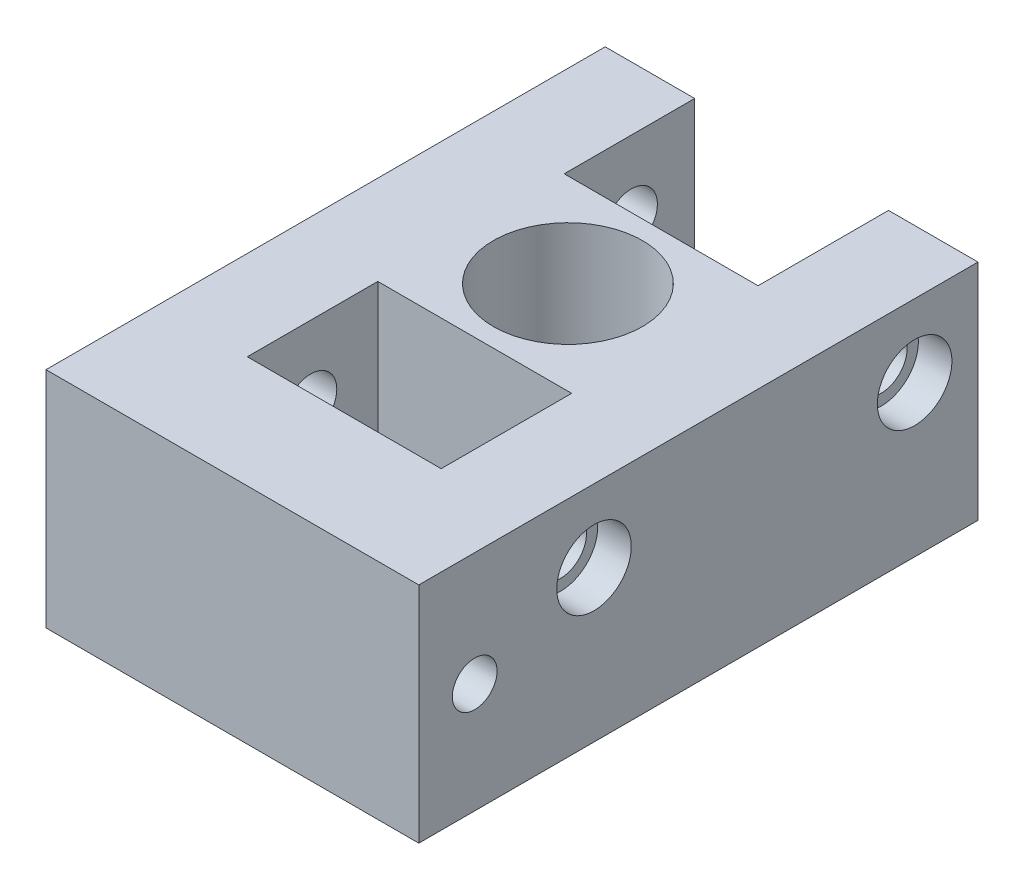
ISO-10303-21;
HEADER;
FILE_DESCRIPTION(('STEP AP214'),'2;1');
FILE_NAME('part.step','',(''),(''),'','','');
FILE_SCHEMA(('AUTOMOTIVE_DESIGN { 1 0 10303 214 1 1 1 1 }'));
ENDSEC;
DATA;
#1=APPLICATION_CONTEXT('core data for automotive mechanical design processes');
#2=APPLICATION_PROTOCOL_DEFINITION('international standard','automotive_design',2000,#1);
#3=PRODUCT_CONTEXT('',#1,'mechanical');
#4=PRODUCT('Part','Part','',(#3));
#5=PRODUCT_RELATED_PRODUCT_CATEGORY('part','',(#4));
#6=PRODUCT_DEFINITION_FORMATION('','',#4);
#7=PRODUCT_DEFINITION_CONTEXT('part definition',#1,'design');
#8=PRODUCT_DEFINITION('design','',#6,#7);
#9=PRODUCT_DEFINITION_SHAPE('','',#8);
#10=(LENGTH_UNIT() NAMED_UNIT(*) SI_UNIT(.MILLI.,.METRE.));
#11=(NAMED_UNIT(*) PLANE_ANGLE_UNIT() SI_UNIT($,.RADIAN.));
#12=(NAMED_UNIT(*) SI_UNIT($,.STERADIAN.) SOLID_ANGLE_UNIT());
#13=UNCERTAINTY_MEASURE_WITH_UNIT(LENGTH_MEASURE(1.E-05),#10,'distance_accuracy_value','');
#14=(GEOMETRIC_REPRESENTATION_CONTEXT(3) GLOBAL_UNCERTAINTY_ASSIGNED_CONTEXT((#13)) GLOBAL_UNIT_ASSIGNED_CONTEXT((#10,
#11,#12)) REPRESENTATION_CONTEXT('',''));
#15=CARTESIAN_POINT('',(0.,0.,0.));
#16=DIRECTION('',(0.,0.,1.));
#17=DIRECTION('',(1.,0.,0.));
#18=AXIS2_PLACEMENT_3D('',#15,#16,#17);
#19=CARTESIAN_POINT('',(10.,4.05,1.7));
#20=DIRECTION('',(-1.,0.,0.));
#21=DIRECTION('',(0.,0.,1.));
#22=AXIS2_PLACEMENT_3D('',#19,#20,#21);
#23=CYLINDRICAL_SURFACE('',#22,0.700000000000001);
#24=CARTESIAN_POINT('',(2.4,4.05,1.7));
#25=DIRECTION('',(-1.,0.,0.));
#26=DIRECTION('',(0.,0.,1.));
#27=AXIS2_PLACEMENT_3D('',#24,#25,#26);
#28=CIRCLE('',#27,0.700000000000001);
#29=CARTESIAN_POINT('',(2.4,4.05,2.4));
#30=VERTEX_POINT('',#29);
#31=EDGE_CURVE('E212',#30,#30,#28,.T.);
#32=ORIENTED_EDGE('',*,*,#31,.F.);
#33=EDGE_LOOP('',(#32));
#34=FACE_BOUND('',#33,.T.);
#35=CARTESIAN_POINT('',(0.9,4.05,1.7));
#36=DIRECTION('',(-1.,0.,0.));
#37=DIRECTION('',(0.,0.,1.));
#38=AXIS2_PLACEMENT_3D('',#35,#36,#37);
#39=CIRCLE('',#38,0.700000000000001);
#40=CARTESIAN_POINT('',(0.9,4.05,2.4));
#41=VERTEX_POINT('',#40);
#42=EDGE_CURVE('E216',#41,#41,#39,.F.);
#43=ORIENTED_EDGE('',*,*,#42,.F.);
#44=EDGE_LOOP('',(#43));
#45=FACE_BOUND('',#44,.T.);
#46=ADVANCED_FACE('F39',(#34,#45),#23,.F.);
#47=CARTESIAN_POINT('',(10.,4.05,10.3));
#48=DIRECTION('',(-1.,0.,0.));
#49=DIRECTION('',(0.,0.,1.));
#50=AXIS2_PLACEMENT_3D('',#47,#48,#49);
#51=CYLINDRICAL_SURFACE('',#50,0.7);
#52=CARTESIAN_POINT('',(2.4,4.05,10.3));
#53=DIRECTION('',(1.,0.,0.));
#54=DIRECTION('',(0.,0.,-1.));
#55=AXIS2_PLACEMENT_3D('',#52,#53,#54);
#56=CIRCLE('',#55,0.7);
#57=CARTESIAN_POINT('',(2.4,4.05,9.60000000000001));
#58=VERTEX_POINT('',#57);
#59=EDGE_CURVE('E156',#58,#58,#56,.T.);
#60=ORIENTED_EDGE('',*,*,#59,.T.);
#61=EDGE_LOOP('',(#60));
#62=FACE_BOUND('',#61,.T.);
#63=CARTESIAN_POINT('',(0.9,4.05,10.3));
#64=DIRECTION('',(-1.,0.,0.));
#65=DIRECTION('',(0.,0.,1.));
#66=AXIS2_PLACEMENT_3D('',#63,#64,#65);
#67=CIRCLE('',#66,0.7);
#68=CARTESIAN_POINT('',(0.9,4.05,11.));
#69=VERTEX_POINT('',#68);
#70=EDGE_CURVE('E220',#69,#69,#67,.F.);
#71=ORIENTED_EDGE('',*,*,#70,.F.);
#72=EDGE_LOOP('',(#71));
#73=FACE_BOUND('',#72,.T.);
#74=ADVANCED_FACE('F359',(#62,#73),#51,.F.);
#75=CARTESIAN_POINT('',(0.,6.,0.));
#76=DIRECTION('',(0.,0.,1.));
#77=DIRECTION('',(1.,0.,0.));
#78=AXIS2_PLACEMENT_3D('',#75,#76,#77);
#79=PLANE('',#78);
#80=DIRECTION('',(0.,1.,0.));
#81=VECTOR('',#80,1.);
#82=CARTESIAN_POINT('',(7.6,-4.26817357768593,0.));
#83=LINE('',#82,#81);
#84=CARTESIAN_POINT('',(7.6,2.,0.));
#85=VERTEX_POINT('',#84);
#86=CARTESIAN_POINT('',(7.6,6.,0.));
#87=VERTEX_POINT('',#86);
#88=EDGE_CURVE('E263',#85,#87,#83,.T.);
#89=ORIENTED_EDGE('',*,*,#88,.T.);
#90=DIRECTION('',(-1.,0.,0.));
#91=VECTOR('',#90,1.);
#92=CARTESIAN_POINT('',(0.,6.,0.));
#93=LINE('',#92,#91);
#94=CARTESIAN_POINT('',(10.,6.,0.));
#95=VERTEX_POINT('',#94);
#96=EDGE_CURVE('E199',#95,#87,#93,.T.);
#97=ORIENTED_EDGE('',*,*,#96,.F.);
#98=DIRECTION('',(0.,-1.,0.));
#99=VECTOR('',#98,1.);
#100=CARTESIAN_POINT('',(10.,6.,0.));
#101=LINE('',#100,#99);
#102=CARTESIAN_POINT('',(10.,0.,0.));
#103=VERTEX_POINT('',#102);
#104=EDGE_CURVE('E12',#95,#103,#101,.T.);
#105=ORIENTED_EDGE('',*,*,#104,.T.);
#106=DIRECTION('',(-1.,0.,0.));
#107=VECTOR('',#106,1.);
#108=CARTESIAN_POINT('',(0.,0.,0.));
#109=LINE('',#108,#107);
#110=CARTESIAN_POINT('',(0.,0.,0.));
#111=VERTEX_POINT('',#110);
#112=EDGE_CURVE('E197',#103,#111,#109,.T.);
#113=ORIENTED_EDGE('',*,*,#112,.T.);
#114=DIRECTION('',(0.,-1.,0.));
#115=VECTOR('',#114,1.);
#116=CARTESIAN_POINT('',(0.,6.,0.));
#117=LINE('',#116,#115);
#118=CARTESIAN_POINT('',(0.,6.,0.));
#119=VERTEX_POINT('',#118);
#120=EDGE_CURVE('E49',#119,#111,#117,.T.);
#121=ORIENTED_EDGE('',*,*,#120,.F.);
#122=CARTESIAN_POINT('',(2.4,6.,0.));
#123=VERTEX_POINT('',#122);
#124=EDGE_CURVE('E58',#123,#119,#93,.T.);
#125=ORIENTED_EDGE('',*,*,#124,.F.);
#126=DIRECTION('',(0.,1.,0.));
#127=VECTOR('',#126,1.);
#128=CARTESIAN_POINT('',(2.4,-4.26817357768593,0.));
#129=LINE('',#128,#127);
#130=CARTESIAN_POINT('',(2.4,2.,0.));
#131=VERTEX_POINT('',#130);
#132=EDGE_CURVE('E113',#131,#123,#129,.T.);
#133=ORIENTED_EDGE('',*,*,#132,.F.);
#134=DIRECTION('',(-1.,0.,0.));
#135=VECTOR('',#134,1.);
#136=CARTESIAN_POINT('',(0.,2.,0.));
#137=LINE('',#136,#135);
#138=EDGE_CURVE('E127',#85,#131,#137,.T.);
#139=ORIENTED_EDGE('',*,*,#138,.F.);
#140=EDGE_LOOP('',(#89,#97,#105,#113,#121,#125,#133,#139));
#141=FACE_BOUND('',#140,.T.);
#142=ADVANCED_FACE('F142',(#141),#79,.F.);
#143=CARTESIAN_POINT('',(0.,6.,0.));
#144=DIRECTION('',(0.,1.,0.));
#145=DIRECTION('',(0.,0.,1.));
#146=AXIS2_PLACEMENT_3D('',#143,#144,#145);
#147=PLANE('',#146);
#148=DIRECTION('',(1.,0.,0.));
#149=VECTOR('',#148,1.);
#150=CARTESIAN_POINT('',(0.,6.,12.));
#151=LINE('',#150,#149);
#152=CARTESIAN_POINT('',(2.4,6.,12.));
#153=VERTEX_POINT('',#152);
#154=CARTESIAN_POINT('',(7.6,6.,12.));
#155=VERTEX_POINT('',#154);
#156=EDGE_CURVE('E301',#153,#155,#151,.T.);
#157=ORIENTED_EDGE('',*,*,#156,.F.);
#158=DIRECTION('',(0.,0.,-1.));
#159=VECTOR('',#158,1.);
#160=CARTESIAN_POINT('',(2.4,6.,12.));
#161=LINE('',#160,#159);
#162=CARTESIAN_POINT('',(2.4,6.,8.5));
#163=VERTEX_POINT('',#162);
#164=EDGE_CURVE('E172',#153,#163,#161,.T.);
#165=ORIENTED_EDGE('',*,*,#164,.T.);
#166=DIRECTION('',(-1.,0.,0.));
#167=VECTOR('',#166,1.);
#168=CARTESIAN_POINT('',(7.6,6.,8.5));
#169=LINE('',#168,#167);
#170=CARTESIAN_POINT('',(7.6,6.,8.5));
#171=VERTEX_POINT('',#170);
#172=EDGE_CURVE('E104',#171,#163,#169,.T.);
#173=ORIENTED_EDGE('',*,*,#172,.F.);
#174=DIRECTION('',(0.,0.,-1.));
#175=VECTOR('',#174,1.);
#176=CARTESIAN_POINT('',(7.6,6.,12.));
#177=LINE('',#176,#175);
#178=EDGE_CURVE('E168',#155,#171,#177,.T.);
#179=ORIENTED_EDGE('',*,*,#178,.F.);
#180=EDGE_LOOP('',(#157,#165,#173,#179));
#181=FACE_BOUND('',#180,.T.);
#182=CARTESIAN_POINT('',(5.,6.,6.));
#183=DIRECTION('',(0.,1.,0.));
#184=DIRECTION('',(0.,0.,1.));
#185=AXIS2_PLACEMENT_3D('',#182,#183,#184);
#186=CIRCLE('',#185,2.);
#187=CARTESIAN_POINT('',(5.,6.,8.));
#188=VERTEX_POINT('',#187);
#189=EDGE_CURVE('E140',#188,#188,#186,.T.);
#190=ORIENTED_EDGE('',*,*,#189,.F.);
#191=EDGE_LOOP('',(#190));
#192=FACE_BOUND('',#191,.T.);
#193=ORIENTED_EDGE('',*,*,#96,.T.);
#194=DIRECTION('',(0.,0.,1.));
#195=VECTOR('',#194,1.);
#196=CARTESIAN_POINT('',(7.6,6.,0.));
#197=LINE('',#196,#195);
#198=CARTESIAN_POINT('',(7.6,6.,3.5));
#199=VERTEX_POINT('',#198);
#200=EDGE_CURVE('E143',#87,#199,#197,.T.);
#201=ORIENTED_EDGE('',*,*,#200,.T.);
#202=DIRECTION('',(-1.,0.,0.));
#203=VECTOR('',#202,1.);
#204=CARTESIAN_POINT('',(7.6,6.,3.5));
#205=LINE('',#204,#203);
#206=CARTESIAN_POINT('',(2.4,6.,3.5));
#207=VERTEX_POINT('',#206);
#208=EDGE_CURVE('E148',#199,#207,#205,.T.);
#209=ORIENTED_EDGE('',*,*,#208,.T.);
#210=DIRECTION('',(0.,0.,1.));
#211=VECTOR('',#210,1.);
#212=CARTESIAN_POINT('',(2.4,6.,0.));
#213=LINE('',#212,#211);
#214=EDGE_CURVE('E175',#123,#207,#213,.T.);
#215=ORIENTED_EDGE('',*,*,#214,.F.);
#216=ORIENTED_EDGE('',*,*,#124,.T.);
#217=DIRECTION('',(0.,0.,1.));
#218=VECTOR('',#217,1.);
#219=CARTESIAN_POINT('',(0.,6.,0.));
#220=LINE('',#219,#218);
#221=CARTESIAN_POINT('',(0.,6.,15.));
#222=VERTEX_POINT('',#221);
#223=EDGE_CURVE('E194',#119,#222,#220,.T.);
#224=ORIENTED_EDGE('',*,*,#223,.T.);
#225=DIRECTION('',(1.,0.,0.));
#226=VECTOR('',#225,1.);
#227=CARTESIAN_POINT('',(0.,6.,15.));
#228=LINE('',#227,#226);
#229=CARTESIAN_POINT('',(10.,6.,15.));
#230=VERTEX_POINT('',#229);
#231=EDGE_CURVE('E316',#222,#230,#228,.T.);
#232=ORIENTED_EDGE('',*,*,#231,.T.);
#233=DIRECTION('',(0.,0.,-1.));
#234=VECTOR('',#233,1.);
#235=CARTESIAN_POINT('',(10.,6.,0.));
#236=LINE('',#235,#234);
#237=EDGE_CURVE('E196',#230,#95,#236,.T.);
#238=ORIENTED_EDGE('',*,*,#237,.T.);
#239=EDGE_LOOP('',(#193,#201,#209,#215,#216,#224,#232,#238));
#240=FACE_BOUND('',#239,.T.);
#241=ADVANCED_FACE('F273',(#181,#192,#240),#147,.T.);
#242=CARTESIAN_POINT('',(5.,0.,10.5));
#243=DIRECTION('',(0.,1.,0.));
#244=DIRECTION('',(0.,0.,1.));
#245=AXIS2_PLACEMENT_3D('',#242,#243,#244);
#246=CYLINDRICAL_SURFACE('',#245,1.);
#247=CARTESIAN_POINT('',(5.,0.,10.5));
#248=DIRECTION('',(0.,1.,0.));
#249=DIRECTION('',(0.,0.,1.));
#250=AXIS2_PLACEMENT_3D('',#247,#248,#249);
#251=CIRCLE('',#250,1.);
#252=CARTESIAN_POINT('',(5.,0.,11.5));
#253=VERTEX_POINT('',#252);
#254=EDGE_CURVE('E187',#253,#253,#251,.T.);
#255=ORIENTED_EDGE('',*,*,#254,.F.);
#256=EDGE_LOOP('',(#255));
#257=FACE_BOUND('',#256,.T.);
#258=CARTESIAN_POINT('',(5.,2.,10.5));
#259=DIRECTION('',(0.,1.,0.));
#260=DIRECTION('',(0.,0.,1.));
#261=AXIS2_PLACEMENT_3D('',#258,#259,#260);
#262=CIRCLE('',#261,1.);
#263=CARTESIAN_POINT('',(5.,2.,11.5));
#264=VERTEX_POINT('',#263);
#265=EDGE_CURVE('E134',#264,#264,#262,.F.);
#266=ORIENTED_EDGE('',*,*,#265,.F.);
#267=EDGE_LOOP('',(#266));
#268=FACE_BOUND('',#267,.T.);
#269=ADVANCED_FACE('F417',(#257,#268),#246,.F.);
#270=CARTESIAN_POINT('',(5.,0.,1.5));
#271=DIRECTION('',(0.,1.,0.));
#272=DIRECTION('',(0.,0.,1.));
#273=AXIS2_PLACEMENT_3D('',#270,#271,#272);
#274=CYLINDRICAL_SURFACE('',#273,1.);
#275=CARTESIAN_POINT('',(5.,0.,1.5));
#276=DIRECTION('',(0.,1.,0.));
#277=DIRECTION('',(0.,0.,1.));
#278=AXIS2_PLACEMENT_3D('',#275,#276,#277);
#279=CIRCLE('',#278,1.);
#280=CARTESIAN_POINT('',(5.,0.,2.5));
#281=VERTEX_POINT('',#280);
#282=EDGE_CURVE('E188',#281,#281,#279,.T.);
#283=ORIENTED_EDGE('',*,*,#282,.F.);
#284=EDGE_LOOP('',(#283));
#285=FACE_BOUND('',#284,.T.);
#286=CARTESIAN_POINT('',(5.,2.,1.5));
#287=DIRECTION('',(0.,1.,0.));
#288=DIRECTION('',(0.,0.,1.));
#289=AXIS2_PLACEMENT_3D('',#286,#287,#288);
#290=CIRCLE('',#289,1.);
#291=CARTESIAN_POINT('',(5.,2.,2.5));
#292=VERTEX_POINT('',#291);
#293=EDGE_CURVE('E135',#292,#292,#290,.F.);
#294=ORIENTED_EDGE('',*,*,#293,.F.);
#295=EDGE_LOOP('',(#294));
#296=FACE_BOUND('',#295,.T.);
#297=ADVANCED_FACE('F414',(#285,#296),#274,.F.);
#298=CARTESIAN_POINT('',(0.,6.,0.));
#299=DIRECTION('',(1.,0.,0.));
#300=DIRECTION('',(0.,0.,-1.));
#301=AXIS2_PLACEMENT_3D('',#298,#299,#300);
#302=PLANE('',#301);
#303=CARTESIAN_POINT('',(0.,2.95143832321382,13.5));
#304=DIRECTION('',(1.,0.,0.));
#305=DIRECTION('',(0.,0.,-1.));
#306=AXIS2_PLACEMENT_3D('',#303,#304,#305);
#307=CIRCLE('',#306,0.6);
#308=CARTESIAN_POINT('',(0.,2.95143832321382,12.9));
#309=VERTEX_POINT('',#308);
#310=EDGE_CURVE('E315',#309,#309,#307,.T.);
#311=ORIENTED_EDGE('',*,*,#310,.T.);
#312=EDGE_LOOP('',(#311));
#313=FACE_BOUND('',#312,.T.);
#314=CARTESIAN_POINT('',(0.,4.05,1.7));
#315=DIRECTION('',(-1.,0.,0.));
#316=DIRECTION('',(0.,0.,1.));
#317=AXIS2_PLACEMENT_3D('',#314,#315,#316);
#318=CIRCLE('',#317,1.);
#319=CARTESIAN_POINT('',(0.,4.05,2.7));
#320=VERTEX_POINT('',#319);
#321=EDGE_CURVE('E248',#320,#320,#318,.T.);
#322=ORIENTED_EDGE('',*,*,#321,.F.);
#323=EDGE_LOOP('',(#322));
#324=FACE_BOUND('',#323,.T.);
#325=CARTESIAN_POINT('',(0.,4.05,10.3));
#326=DIRECTION('',(-1.,0.,0.));
#327=DIRECTION('',(0.,0.,1.));
#328=AXIS2_PLACEMENT_3D('',#325,#326,#327);
#329=CIRCLE('',#328,1.);
#330=CARTESIAN_POINT('',(0.,4.05,11.3));
#331=VERTEX_POINT('',#330);
#332=EDGE_CURVE('E251',#331,#331,#329,.T.);
#333=ORIENTED_EDGE('',*,*,#332,.F.);
#334=EDGE_LOOP('',(#333));
#335=FACE_BOUND('',#334,.T.);
#336=DIRECTION('',(0.,0.,1.));
#337=VECTOR('',#336,1.);
#338=CARTESIAN_POINT('',(0.,0.,0.));
#339=LINE('',#338,#337);
#340=CARTESIAN_POINT('',(0.,0.,15.));
#341=VERTEX_POINT('',#340);
#342=EDGE_CURVE('E191',#111,#341,#339,.T.);
#343=ORIENTED_EDGE('',*,*,#342,.T.);
#344=DIRECTION('',(0.,1.,0.));
#345=VECTOR('',#344,1.);
#346=CARTESIAN_POINT('',(0.,0.,15.));
#347=LINE('',#346,#345);
#348=EDGE_CURVE('E290',#341,#222,#347,.T.);
#349=ORIENTED_EDGE('',*,*,#348,.T.);
#350=ORIENTED_EDGE('',*,*,#223,.F.);
#351=ORIENTED_EDGE('',*,*,#120,.T.);
#352=EDGE_LOOP('',(#343,#349,#350,#351));
#353=FACE_BOUND('',#352,.T.);
#354=ADVANCED_FACE('F41',(#313,#324,#335,#353),#302,.F.);
#355=CARTESIAN_POINT('',(10.,6.,0.));
#356=DIRECTION('',(-1.,0.,0.));
#357=DIRECTION('',(0.,0.,1.));
#358=AXIS2_PLACEMENT_3D('',#355,#356,#357);
#359=PLANE('',#358);
#360=CARTESIAN_POINT('',(10.,2.95143832321382,13.5));
#361=DIRECTION('',(1.,0.,0.));
#362=DIRECTION('',(0.,0.,-1.));
#363=AXIS2_PLACEMENT_3D('',#360,#361,#362);
#364=CIRCLE('',#363,0.6);
#365=CARTESIAN_POINT('',(10.,2.95143832321382,12.9));
#366=VERTEX_POINT('',#365);
#367=EDGE_CURVE('E319',#366,#366,#364,.T.);
#368=ORIENTED_EDGE('',*,*,#367,.F.);
#369=EDGE_LOOP('',(#368));
#370=FACE_BOUND('',#369,.T.);
#371=CARTESIAN_POINT('',(10.,4.05,1.7));
#372=DIRECTION('',(-1.,0.,0.));
#373=DIRECTION('',(0.,0.,1.));
#374=AXIS2_PLACEMENT_3D('',#371,#372,#373);
#375=CIRCLE('',#374,1.);
#376=CARTESIAN_POINT('',(10.,4.05,2.7));
#377=VERTEX_POINT('',#376);
#378=EDGE_CURVE('E233',#377,#377,#375,.T.);
#379=ORIENTED_EDGE('',*,*,#378,.T.);
#380=EDGE_LOOP('',(#379));
#381=FACE_BOUND('',#380,.T.);
#382=CARTESIAN_POINT('',(10.,4.05,10.3));
#383=DIRECTION('',(-1.,0.,0.));
#384=DIRECTION('',(0.,0.,1.));
#385=AXIS2_PLACEMENT_3D('',#382,#383,#384);
#386=CIRCLE('',#385,1.);
#387=CARTESIAN_POINT('',(10.,4.05,11.3));
#388=VERTEX_POINT('',#387);
#389=EDGE_CURVE('E238',#388,#388,#386,.T.);
#390=ORIENTED_EDGE('',*,*,#389,.T.);
#391=EDGE_LOOP('',(#390));
#392=FACE_BOUND('',#391,.T.);
#393=DIRECTION('',(0.,0.,-1.));
#394=VECTOR('',#393,1.);
#395=CARTESIAN_POINT('',(10.,0.,0.));
#396=LINE('',#395,#394);
#397=CARTESIAN_POINT('',(10.,0.,15.));
#398=VERTEX_POINT('',#397);
#399=EDGE_CURVE('E70',#398,#103,#396,.T.);
#400=ORIENTED_EDGE('',*,*,#399,.T.);
#401=ORIENTED_EDGE('',*,*,#104,.F.);
#402=ORIENTED_EDGE('',*,*,#237,.F.);
#403=DIRECTION('',(0.,1.,0.));
#404=VECTOR('',#403,1.);
#405=CARTESIAN_POINT('',(10.,0.,15.));
#406=LINE('',#405,#404);
#407=EDGE_CURVE('E323',#398,#230,#406,.T.);
#408=ORIENTED_EDGE('',*,*,#407,.F.);
#409=EDGE_LOOP('',(#400,#401,#402,#408));
#410=FACE_BOUND('',#409,.T.);
#411=ADVANCED_FACE('F332',(#370,#381,#392,#410),#359,.F.);
#412=CARTESIAN_POINT('',(0.,0.,0.));
#413=DIRECTION('',(0.,1.,0.));
#414=DIRECTION('',(0.,0.,1.));
#415=AXIS2_PLACEMENT_3D('',#412,#413,#414);
#416=PLANE('',#415);
#417=CARTESIAN_POINT('',(5.,0.,6.));
#418=DIRECTION('',(0.,1.,0.));
#419=DIRECTION('',(0.,0.,1.));
#420=AXIS2_PLACEMENT_3D('',#417,#418,#419);
#421=CIRCLE('',#420,2.);
#422=CARTESIAN_POINT('',(5.,0.,8.));
#423=VERTEX_POINT('',#422);
#424=EDGE_CURVE('E179',#423,#423,#421,.T.);
#425=ORIENTED_EDGE('',*,*,#424,.T.);
#426=EDGE_LOOP('',(#425));
#427=FACE_BOUND('',#426,.T.);
#428=ORIENTED_EDGE('',*,*,#282,.T.);
#429=EDGE_LOOP('',(#428));
#430=FACE_BOUND('',#429,.T.);
#431=ORIENTED_EDGE('',*,*,#254,.T.);
#432=EDGE_LOOP('',(#431));
#433=FACE_BOUND('',#432,.T.);
#434=ORIENTED_EDGE('',*,*,#342,.F.);
#435=ORIENTED_EDGE('',*,*,#112,.F.);
#436=ORIENTED_EDGE('',*,*,#399,.F.);
#437=DIRECTION('',(1.,0.,0.));
#438=VECTOR('',#437,1.);
#439=CARTESIAN_POINT('',(0.,0.,15.));
#440=LINE('',#439,#438);
#441=EDGE_CURVE('E245',#341,#398,#440,.T.);
#442=ORIENTED_EDGE('',*,*,#441,.F.);
#443=EDGE_LOOP('',(#434,#435,#436,#442));
#444=FACE_BOUND('',#443,.T.);
#445=ADVANCED_FACE('F280',(#427,#430,#433,#444),#416,.F.);
#446=CARTESIAN_POINT('',(0.,2.,0.));
#447=DIRECTION('',(0.,1.,0.));
#448=DIRECTION('',(0.,0.,1.));
#449=AXIS2_PLACEMENT_3D('',#446,#447,#448);
#450=PLANE('',#449);
#451=ORIENTED_EDGE('',*,*,#293,.T.);
#452=EDGE_LOOP('',(#451));
#453=FACE_BOUND('',#452,.T.);
#454=ORIENTED_EDGE('',*,*,#138,.T.);
#455=DIRECTION('',(0.,0.,-1.));
#456=VECTOR('',#455,1.);
#457=CARTESIAN_POINT('',(2.4,2.,0.));
#458=LINE('',#457,#456);
#459=CARTESIAN_POINT('',(2.4,2.,3.5));
#460=VERTEX_POINT('',#459);
#461=EDGE_CURVE('E129',#460,#131,#458,.T.);
#462=ORIENTED_EDGE('',*,*,#461,.F.);
#463=DIRECTION('',(1.,0.,0.));
#464=VECTOR('',#463,1.);
#465=CARTESIAN_POINT('',(7.6,2.,3.5));
#466=LINE('',#465,#464);
#467=CARTESIAN_POINT('',(7.6,2.,3.5));
#468=VERTEX_POINT('',#467);
#469=EDGE_CURVE('E79',#460,#468,#466,.T.);
#470=ORIENTED_EDGE('',*,*,#469,.T.);
#471=DIRECTION('',(0.,0.,-1.));
#472=VECTOR('',#471,1.);
#473=CARTESIAN_POINT('',(7.6,2.,0.));
#474=LINE('',#473,#472);
#475=EDGE_CURVE('E130',#468,#85,#474,.T.);
#476=ORIENTED_EDGE('',*,*,#475,.T.);
#477=EDGE_LOOP('',(#454,#462,#470,#476));
#478=FACE_BOUND('',#477,.T.);
#479=ADVANCED_FACE('F128',(#453,#478),#450,.T.);
#480=CARTESIAN_POINT('',(0.,2.,0.));
#481=DIRECTION('',(0.,1.,0.));
#482=DIRECTION('',(0.,0.,1.));
#483=AXIS2_PLACEMENT_3D('',#480,#481,#482);
#484=PLANE('',#483);
#485=ORIENTED_EDGE('',*,*,#265,.T.);
#486=EDGE_LOOP('',(#485));
#487=FACE_BOUND('',#486,.T.);
#488=DIRECTION('',(1.,0.,0.));
#489=VECTOR('',#488,1.);
#490=CARTESIAN_POINT('',(0.,2.,12.));
#491=LINE('',#490,#489);
#492=CARTESIAN_POINT('',(2.4,2.,12.));
#493=VERTEX_POINT('',#492);
#494=CARTESIAN_POINT('',(7.6,2.,12.));
#495=VERTEX_POINT('',#494);
#496=EDGE_CURVE('E184',#493,#495,#491,.T.);
#497=ORIENTED_EDGE('',*,*,#496,.T.);
#498=DIRECTION('',(0.,0.,1.));
#499=VECTOR('',#498,1.);
#500=CARTESIAN_POINT('',(7.6,2.,12.));
#501=LINE('',#500,#499);
#502=CARTESIAN_POINT('',(7.6,2.,8.5));
#503=VERTEX_POINT('',#502);
#504=EDGE_CURVE('E152',#503,#495,#501,.T.);
#505=ORIENTED_EDGE('',*,*,#504,.F.);
#506=DIRECTION('',(1.,0.,0.));
#507=VECTOR('',#506,1.);
#508=CARTESIAN_POINT('',(7.6,2.,8.5));
#509=LINE('',#508,#507);
#510=CARTESIAN_POINT('',(2.4,2.,8.5));
#511=VERTEX_POINT('',#510);
#512=EDGE_CURVE('E161',#511,#503,#509,.T.);
#513=ORIENTED_EDGE('',*,*,#512,.F.);
#514=DIRECTION('',(0.,0.,1.));
#515=VECTOR('',#514,1.);
#516=CARTESIAN_POINT('',(2.4,2.,12.));
#517=LINE('',#516,#515);
#518=EDGE_CURVE('E155',#511,#493,#517,.T.);
#519=ORIENTED_EDGE('',*,*,#518,.T.);
#520=EDGE_LOOP('',(#497,#505,#513,#519));
#521=FACE_BOUND('',#520,.T.);
#522=ADVANCED_FACE('F308',(#487,#521),#484,.T.);
#523=CARTESIAN_POINT('',(5.,0.,6.));
#524=DIRECTION('',(0.,1.,0.));
#525=DIRECTION('',(0.,0.,1.));
#526=AXIS2_PLACEMENT_3D('',#523,#524,#525);
#527=CYLINDRICAL_SURFACE('',#526,2.);
#528=ORIENTED_EDGE('',*,*,#424,.F.);
#529=EDGE_LOOP('',(#528));
#530=FACE_BOUND('',#529,.T.);
#531=ORIENTED_EDGE('',*,*,#189,.T.);
#532=EDGE_LOOP('',(#531));
#533=FACE_BOUND('',#532,.T.);
#534=ADVANCED_FACE('F401',(#530,#533),#527,.F.);
#535=CARTESIAN_POINT('',(7.6,-4.26817357768593,8.5));
#536=DIRECTION('',(0.,0.,-1.));
#537=DIRECTION('',(-1.,0.,0.));
#538=AXIS2_PLACEMENT_3D('',#535,#536,#537);
#539=PLANE('',#538);
#540=ORIENTED_EDGE('',*,*,#172,.T.);
#541=DIRECTION('',(0.,1.,0.));
#542=VECTOR('',#541,1.);
#543=CARTESIAN_POINT('',(2.4,-4.26817357768593,8.5));
#544=LINE('',#543,#542);
#545=EDGE_CURVE('E160',#511,#163,#544,.T.);
#546=ORIENTED_EDGE('',*,*,#545,.F.);
#547=ORIENTED_EDGE('',*,*,#512,.T.);
#548=DIRECTION('',(0.,1.,0.));
#549=VECTOR('',#548,1.);
#550=CARTESIAN_POINT('',(7.6,-4.26817357768593,8.5));
#551=LINE('',#550,#549);
#552=EDGE_CURVE('E163',#503,#171,#551,.T.);
#553=ORIENTED_EDGE('',*,*,#552,.T.);
#554=EDGE_LOOP('',(#540,#546,#547,#553));
#555=FACE_BOUND('',#554,.T.);
#556=ADVANCED_FACE('F397',(#555),#539,.F.);
#557=CARTESIAN_POINT('',(2.4,-4.26817357768593,12.));
#558=DIRECTION('',(1.,0.,0.));
#559=DIRECTION('',(0.,0.,-1.));
#560=AXIS2_PLACEMENT_3D('',#557,#558,#559);
#561=PLANE('',#560);
#562=ORIENTED_EDGE('',*,*,#59,.F.);
#563=EDGE_LOOP('',(#562));
#564=FACE_BOUND('',#563,.T.);
#565=ORIENTED_EDGE('',*,*,#545,.T.);
#566=ORIENTED_EDGE('',*,*,#164,.F.);
#567=DIRECTION('',(0.,1.,0.));
#568=VECTOR('',#567,1.);
#569=CARTESIAN_POINT('',(2.4,-4.26817357768593,12.));
#570=LINE('',#569,#568);
#571=EDGE_CURVE('E157',#493,#153,#570,.T.);
#572=ORIENTED_EDGE('',*,*,#571,.F.);
#573=ORIENTED_EDGE('',*,*,#518,.F.);
#574=EDGE_LOOP('',(#565,#566,#572,#573));
#575=FACE_BOUND('',#574,.T.);
#576=ADVANCED_FACE('F311',(#564,#575),#561,.T.);
#577=CARTESIAN_POINT('',(7.6,-4.26817357768593,12.));
#578=DIRECTION('',(1.,0.,0.));
#579=DIRECTION('',(0.,0.,-1.));
#580=AXIS2_PLACEMENT_3D('',#577,#578,#579);
#581=PLANE('',#580);
#582=CARTESIAN_POINT('',(7.6,4.05,10.3));
#583=DIRECTION('',(1.,0.,0.));
#584=DIRECTION('',(0.,0.,-1.));
#585=AXIS2_PLACEMENT_3D('',#582,#583,#584);
#586=CIRCLE('',#585,0.7);
#587=CARTESIAN_POINT('',(7.6,4.05,9.60000000000001));
#588=VERTEX_POINT('',#587);
#589=EDGE_CURVE('E217',#588,#588,#586,.T.);
#590=ORIENTED_EDGE('',*,*,#589,.T.);
#591=EDGE_LOOP('',(#590));
#592=FACE_BOUND('',#591,.T.);
#593=ORIENTED_EDGE('',*,*,#504,.T.);
#594=DIRECTION('',(0.,1.,0.));
#595=VECTOR('',#594,1.);
#596=CARTESIAN_POINT('',(7.6,-4.26817357768593,12.));
#597=LINE('',#596,#595);
#598=EDGE_CURVE('E165',#495,#155,#597,.T.);
#599=ORIENTED_EDGE('',*,*,#598,.T.);
#600=ORIENTED_EDGE('',*,*,#178,.T.);
#601=ORIENTED_EDGE('',*,*,#552,.F.);
#602=EDGE_LOOP('',(#593,#599,#600,#601));
#603=FACE_BOUND('',#602,.T.);
#604=ADVANCED_FACE('F392',(#592,#603),#581,.F.);
#605=CARTESIAN_POINT('',(7.6,-4.26817357768593,3.5));
#606=DIRECTION('',(0.,0.,-1.));
#607=DIRECTION('',(-1.,0.,0.));
#608=AXIS2_PLACEMENT_3D('',#605,#606,#607);
#609=PLANE('',#608);
#610=ORIENTED_EDGE('',*,*,#208,.F.);
#611=DIRECTION('',(0.,1.,0.));
#612=VECTOR('',#611,1.);
#613=CARTESIAN_POINT('',(7.6,-4.26817357768593,3.5));
#614=LINE('',#613,#612);
#615=EDGE_CURVE('E145',#468,#199,#614,.T.);
#616=ORIENTED_EDGE('',*,*,#615,.F.);
#617=ORIENTED_EDGE('',*,*,#469,.F.);
#618=DIRECTION('',(0.,1.,0.));
#619=VECTOR('',#618,1.);
#620=CARTESIAN_POINT('',(2.4,-4.26817357768593,3.5));
#621=LINE('',#620,#619);
#622=EDGE_CURVE('E139',#460,#207,#621,.T.);
#623=ORIENTED_EDGE('',*,*,#622,.T.);
#624=EDGE_LOOP('',(#610,#616,#617,#623));
#625=FACE_BOUND('',#624,.T.);
#626=ADVANCED_FACE('F387',(#625),#609,.T.);
#627=CARTESIAN_POINT('',(7.6,-4.26817357768593,0.));
#628=DIRECTION('',(-1.,0.,0.));
#629=DIRECTION('',(0.,0.,1.));
#630=AXIS2_PLACEMENT_3D('',#627,#628,#629);
#631=PLANE('',#630);
#632=CARTESIAN_POINT('',(7.6,4.05,1.7));
#633=DIRECTION('',(-1.,0.,0.));
#634=DIRECTION('',(0.,0.,1.));
#635=AXIS2_PLACEMENT_3D('',#632,#633,#634);
#636=CIRCLE('',#635,0.700000000000001);
#637=CARTESIAN_POINT('',(7.6,4.05,2.4));
#638=VERTEX_POINT('',#637);
#639=EDGE_CURVE('E215',#638,#638,#636,.T.);
#640=ORIENTED_EDGE('',*,*,#639,.F.);
#641=EDGE_LOOP('',(#640));
#642=FACE_BOUND('',#641,.T.);
#643=ORIENTED_EDGE('',*,*,#615,.T.);
#644=ORIENTED_EDGE('',*,*,#200,.F.);
#645=ORIENTED_EDGE('',*,*,#88,.F.);
#646=ORIENTED_EDGE('',*,*,#475,.F.);
#647=EDGE_LOOP('',(#643,#644,#645,#646));
#648=FACE_BOUND('',#647,.T.);
#649=ADVANCED_FACE('F271',(#642,#648),#631,.T.);
#650=CARTESIAN_POINT('',(2.4,-4.26817357768593,0.));
#651=DIRECTION('',(-1.,0.,0.));
#652=DIRECTION('',(0.,0.,1.));
#653=AXIS2_PLACEMENT_3D('',#650,#651,#652);
#654=PLANE('',#653);
#655=ORIENTED_EDGE('',*,*,#31,.T.);
#656=EDGE_LOOP('',(#655));
#657=FACE_BOUND('',#656,.T.);
#658=ORIENTED_EDGE('',*,*,#461,.T.);
#659=ORIENTED_EDGE('',*,*,#132,.T.);
#660=ORIENTED_EDGE('',*,*,#214,.T.);
#661=ORIENTED_EDGE('',*,*,#622,.F.);
#662=EDGE_LOOP('',(#658,#659,#660,#661));
#663=FACE_BOUND('',#662,.T.);
#664=ADVANCED_FACE('F138',(#657,#663),#654,.F.);
#665=CARTESIAN_POINT('',(9.1,4.05,1.7));
#666=DIRECTION('',(-1.,0.,0.));
#667=DIRECTION('',(0.,0.,1.));
#668=AXIS2_PLACEMENT_3D('',#665,#666,#667);
#669=CIRCLE('',#668,0.700000000000001);
#670=CARTESIAN_POINT('',(9.1,4.05,2.4));
#671=VERTEX_POINT('',#670);
#672=EDGE_CURVE('E43',#671,#671,#669,.F.);
#673=ORIENTED_EDGE('',*,*,#672,.T.);
#674=EDGE_LOOP('',(#673));
#675=FACE_BOUND('',#674,.T.);
#676=ORIENTED_EDGE('',*,*,#639,.T.);
#677=EDGE_LOOP('',(#676));
#678=FACE_BOUND('',#677,.T.);
#679=ADVANCED_FACE('F362',(#675,#678),#23,.F.);
#680=CARTESIAN_POINT('',(9.1,4.05,10.3));
#681=DIRECTION('',(-1.,0.,0.));
#682=DIRECTION('',(0.,0.,1.));
#683=AXIS2_PLACEMENT_3D('',#680,#681,#682);
#684=CIRCLE('',#683,0.7);
#685=CARTESIAN_POINT('',(9.1,4.05,11.));
#686=VERTEX_POINT('',#685);
#687=EDGE_CURVE('E225',#686,#686,#684,.F.);
#688=ORIENTED_EDGE('',*,*,#687,.T.);
#689=EDGE_LOOP('',(#688));
#690=FACE_BOUND('',#689,.T.);
#691=ORIENTED_EDGE('',*,*,#589,.F.);
#692=EDGE_LOOP('',(#691));
#693=FACE_BOUND('',#692,.T.);
#694=ADVANCED_FACE('F369',(#690,#693),#51,.F.);
#695=CARTESIAN_POINT('',(0.899999999999999,-4.26817357768593,0.));
#696=DIRECTION('',(-1.,0.,0.));
#697=DIRECTION('',(0.,0.,1.));
#698=AXIS2_PLACEMENT_3D('',#695,#696,#697);
#699=PLANE('',#698);
#700=CARTESIAN_POINT('',(0.899999999999999,4.05,10.3));
#701=DIRECTION('',(-1.,0.,0.));
#702=DIRECTION('',(0.,0.,1.));
#703=AXIS2_PLACEMENT_3D('',#700,#701,#702);
#704=CIRCLE('',#703,1.);
#705=CARTESIAN_POINT('',(0.899999999999999,4.05,11.3));
#706=VERTEX_POINT('',#705);
#707=EDGE_CURVE('E231',#706,#706,#704,.F.);
#708=ORIENTED_EDGE('',*,*,#707,.F.);
#709=EDGE_LOOP('',(#708));
#710=FACE_BOUND('',#709,.T.);
#711=ORIENTED_EDGE('',*,*,#70,.T.);
#712=EDGE_LOOP('',(#711));
#713=FACE_BOUND('',#712,.T.);
#714=ADVANCED_FACE('F379',(#710,#713),#699,.T.);
#715=CARTESIAN_POINT('',(5.22842712474619,4.05,10.3));
#716=DIRECTION('',(-1.,0.,0.));
#717=DIRECTION('',(0.,0.,1.));
#718=AXIS2_PLACEMENT_3D('',#715,#716,#717);
#719=CYLINDRICAL_SURFACE('',#718,1.);
#720=ORIENTED_EDGE('',*,*,#707,.T.);
#721=EDGE_LOOP('',(#720));
#722=FACE_BOUND('',#721,.T.);
#723=ORIENTED_EDGE('',*,*,#332,.T.);
#724=EDGE_LOOP('',(#723));
#725=FACE_BOUND('',#724,.T.);
#726=ADVANCED_FACE('F489',(#722,#725),#719,.F.);
#727=CARTESIAN_POINT('',(0.899999999999999,-4.26817357768593,0.));
#728=DIRECTION('',(-1.,0.,0.));
#729=DIRECTION('',(0.,0.,1.));
#730=AXIS2_PLACEMENT_3D('',#727,#728,#729);
#731=PLANE('',#730);
#732=CARTESIAN_POINT('',(0.9,4.05,1.7));
#733=DIRECTION('',(-1.,0.,0.));
#734=DIRECTION('',(0.,0.,1.));
#735=AXIS2_PLACEMENT_3D('',#732,#733,#734);
#736=CIRCLE('',#735,1.);
#737=CARTESIAN_POINT('',(0.9,4.05,2.7));
#738=VERTEX_POINT('',#737);
#739=EDGE_CURVE('E223',#738,#738,#736,.F.);
#740=ORIENTED_EDGE('',*,*,#739,.F.);
#741=EDGE_LOOP('',(#740));
#742=FACE_BOUND('',#741,.T.);
#743=ORIENTED_EDGE('',*,*,#42,.T.);
#744=EDGE_LOOP('',(#743));
#745=FACE_BOUND('',#744,.T.);
#746=ADVANCED_FACE('F354',(#742,#745),#731,.T.);
#747=CARTESIAN_POINT('',(5.22842712474619,4.05,1.7));
#748=DIRECTION('',(-1.,0.,0.));
#749=DIRECTION('',(0.,0.,1.));
#750=AXIS2_PLACEMENT_3D('',#747,#748,#749);
#751=CYLINDRICAL_SURFACE('',#750,1.);
#752=ORIENTED_EDGE('',*,*,#739,.T.);
#753=EDGE_LOOP('',(#752));
#754=FACE_BOUND('',#753,.T.);
#755=ORIENTED_EDGE('',*,*,#321,.T.);
#756=EDGE_LOOP('',(#755));
#757=FACE_BOUND('',#756,.T.);
#758=ADVANCED_FACE('F349',(#754,#757),#751,.F.);
#759=CARTESIAN_POINT('',(9.1,-4.26817357768593,0.));
#760=DIRECTION('',(-1.,0.,0.));
#761=DIRECTION('',(0.,0.,1.));
#762=AXIS2_PLACEMENT_3D('',#759,#760,#761);
#763=PLANE('',#762);
#764=CARTESIAN_POINT('',(9.1,4.05,10.3));
#765=DIRECTION('',(-1.,0.,0.));
#766=DIRECTION('',(0.,0.,1.));
#767=AXIS2_PLACEMENT_3D('',#764,#765,#766);
#768=CIRCLE('',#767,1.);
#769=CARTESIAN_POINT('',(9.1,4.05,11.3));
#770=VERTEX_POINT('',#769);
#771=EDGE_CURVE('E242',#770,#770,#768,.T.);
#772=ORIENTED_EDGE('',*,*,#771,.F.);
#773=EDGE_LOOP('',(#772));
#774=FACE_BOUND('',#773,.T.);
#775=ORIENTED_EDGE('',*,*,#687,.F.);
#776=EDGE_LOOP('',(#775));
#777=FACE_BOUND('',#776,.T.);
#778=ADVANCED_FACE('F343',(#774,#777),#763,.F.);
#779=CARTESIAN_POINT('',(4.77157287525381,4.05,10.3));
#780=DIRECTION('',(1.,0.,0.));
#781=DIRECTION('',(0.,0.,-1.));
#782=AXIS2_PLACEMENT_3D('',#779,#780,#781);
#783=CYLINDRICAL_SURFACE('',#782,1.);
#784=ORIENTED_EDGE('',*,*,#389,.F.);
#785=EDGE_LOOP('',(#784));
#786=FACE_BOUND('',#785,.T.);
#787=ORIENTED_EDGE('',*,*,#771,.T.);
#788=EDGE_LOOP('',(#787));
#789=FACE_BOUND('',#788,.T.);
#790=ADVANCED_FACE('F339',(#786,#789),#783,.F.);
#791=CARTESIAN_POINT('',(9.1,-4.26817357768593,0.));
#792=DIRECTION('',(-1.,0.,0.));
#793=DIRECTION('',(0.,0.,1.));
#794=AXIS2_PLACEMENT_3D('',#791,#792,#793);
#795=PLANE('',#794);
#796=CARTESIAN_POINT('',(9.1,4.05,1.7));
#797=DIRECTION('',(-1.,0.,0.));
#798=DIRECTION('',(0.,0.,1.));
#799=AXIS2_PLACEMENT_3D('',#796,#797,#798);
#800=CIRCLE('',#799,1.);
#801=CARTESIAN_POINT('',(9.1,4.05,2.7));
#802=VERTEX_POINT('',#801);
#803=EDGE_CURVE('E227',#802,#802,#800,.T.);
#804=ORIENTED_EDGE('',*,*,#803,.F.);
#805=EDGE_LOOP('',(#804));
#806=FACE_BOUND('',#805,.T.);
#807=ORIENTED_EDGE('',*,*,#672,.F.);
#808=EDGE_LOOP('',(#807));
#809=FACE_BOUND('',#808,.T.);
#810=ADVANCED_FACE('F342',(#806,#809),#795,.F.);
#811=CARTESIAN_POINT('',(4.77157287525381,4.05,1.7));
#812=DIRECTION('',(1.,0.,0.));
#813=DIRECTION('',(0.,0.,-1.));
#814=AXIS2_PLACEMENT_3D('',#811,#812,#813);
#815=CYLINDRICAL_SURFACE('',#814,1.);
#816=ORIENTED_EDGE('',*,*,#378,.F.);
#817=EDGE_LOOP('',(#816));
#818=FACE_BOUND('',#817,.T.);
#819=ORIENTED_EDGE('',*,*,#803,.T.);
#820=EDGE_LOOP('',(#819));
#821=FACE_BOUND('',#820,.T.);
#822=ADVANCED_FACE('F540',(#818,#821),#815,.F.);
#823=CARTESIAN_POINT('',(0.,0.,15.));
#824=DIRECTION('',(0.,0.,-1.));
#825=DIRECTION('',(-1.,0.,0.));
#826=AXIS2_PLACEMENT_3D('',#823,#824,#825);
#827=PLANE('',#826);
#828=ORIENTED_EDGE('',*,*,#348,.F.);
#829=ORIENTED_EDGE('',*,*,#441,.T.);
#830=ORIENTED_EDGE('',*,*,#407,.T.);
#831=ORIENTED_EDGE('',*,*,#231,.F.);
#832=EDGE_LOOP('',(#828,#829,#830,#831));
#833=FACE_BOUND('',#832,.T.);
#834=ADVANCED_FACE('F549',(#833),#827,.F.);
#835=CARTESIAN_POINT('',(0.,0.,12.));
#836=DIRECTION('',(0.,0.,-1.));
#837=DIRECTION('',(-1.,0.,0.));
#838=AXIS2_PLACEMENT_3D('',#835,#836,#837);
#839=PLANE('',#838);
#840=ORIENTED_EDGE('',*,*,#496,.F.);
#841=ORIENTED_EDGE('',*,*,#571,.T.);
#842=ORIENTED_EDGE('',*,*,#156,.T.);
#843=ORIENTED_EDGE('',*,*,#598,.F.);
#844=EDGE_LOOP('',(#840,#841,#842,#843));
#845=FACE_BOUND('',#844,.T.);
#846=ADVANCED_FACE('F303',(#845),#839,.T.);
#847=CARTESIAN_POINT('',(0.,2.95143832321382,13.5));
#848=DIRECTION('',(1.,0.,0.));
#849=DIRECTION('',(0.,0.,-1.));
#850=AXIS2_PLACEMENT_3D('',#847,#848,#849);
#851=CYLINDRICAL_SURFACE('',#850,0.6);
#852=ORIENTED_EDGE('',*,*,#310,.F.);
#853=EDGE_LOOP('',(#852));
#854=FACE_BOUND('',#853,.T.);
#855=ORIENTED_EDGE('',*,*,#367,.T.);
#856=EDGE_LOOP('',(#855));
#857=FACE_BOUND('',#856,.T.);
#858=ADVANCED_FACE('F330',(#854,#857),#851,.F.);
#859=CLOSED_SHELL('',(#46,#74,#142,#241,#269,#297,#354,#411,#445,#479,#522,#534,#556,#576,#604,
#626,#649,#664,#679,#694,#714,#726,#746,#758,#778,#790,#810,#822,#834,#846,#858));
#860=MANIFOLD_SOLID_BREP('B2',#859);
#861=ADVANCED_BREP_SHAPE_REPRESENTATION('',(#18,#860),#14);
#862=SHAPE_DEFINITION_REPRESENTATION(#9,#861);
ENDSEC;
END-ISO-10303-21;
